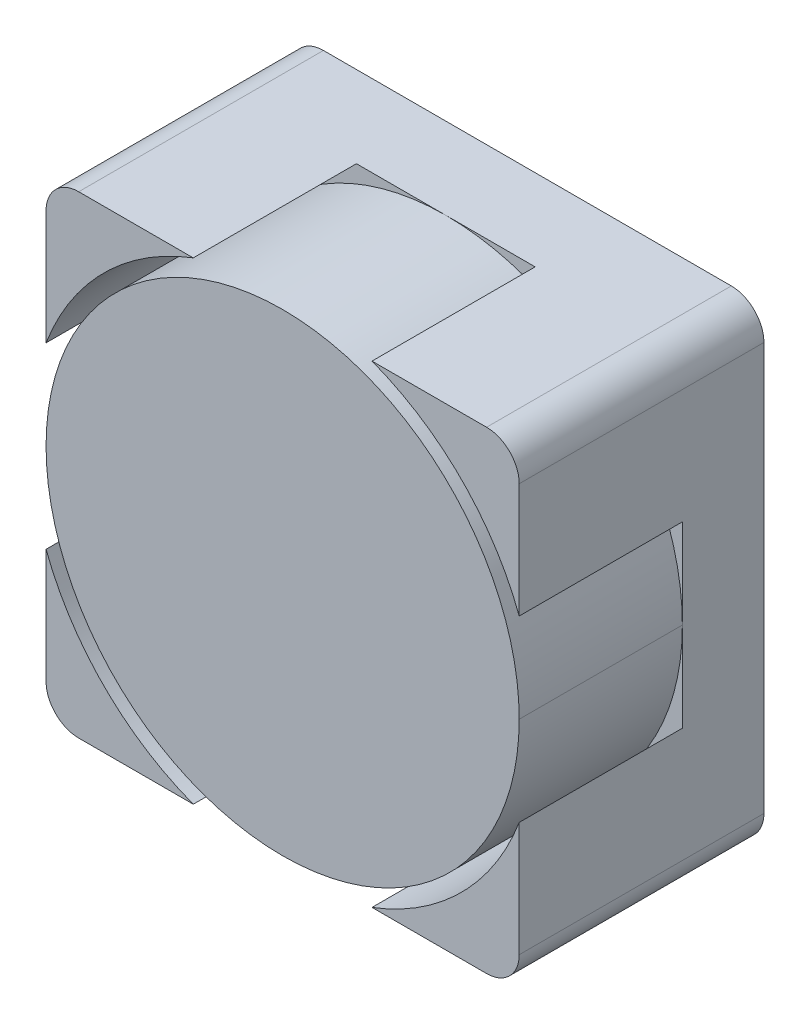
ISO-10303-21;
HEADER;
FILE_DESCRIPTION(('STEP AP214'),'2;1');
FILE_NAME('part.step','',(''),(''),'','','');
FILE_SCHEMA(('AUTOMOTIVE_DESIGN { 1 0 10303 214 1 1 1 1 }'));
ENDSEC;
DATA;
#1=APPLICATION_CONTEXT('core data for automotive mechanical design processes');
#2=APPLICATION_PROTOCOL_DEFINITION('international standard','automotive_design',2000,#1);
#3=PRODUCT_CONTEXT('',#1,'mechanical');
#4=PRODUCT('Part','Part','',(#3));
#5=PRODUCT_RELATED_PRODUCT_CATEGORY('part','',(#4));
#6=PRODUCT_DEFINITION_FORMATION('','',#4);
#7=PRODUCT_DEFINITION_CONTEXT('part definition',#1,'design');
#8=PRODUCT_DEFINITION('design','',#6,#7);
#9=PRODUCT_DEFINITION_SHAPE('','',#8);
#10=(LENGTH_UNIT() NAMED_UNIT(*) SI_UNIT(.MILLI.,.METRE.));
#11=(NAMED_UNIT(*) PLANE_ANGLE_UNIT() SI_UNIT($,.RADIAN.));
#12=(NAMED_UNIT(*) SI_UNIT($,.STERADIAN.) SOLID_ANGLE_UNIT());
#13=UNCERTAINTY_MEASURE_WITH_UNIT(LENGTH_MEASURE(1.E-05),#10,'distance_accuracy_value','');
#14=(GEOMETRIC_REPRESENTATION_CONTEXT(3) GLOBAL_UNCERTAINTY_ASSIGNED_CONTEXT((#13)) GLOBAL_UNIT_ASSIGNED_CONTEXT((#10,
#11,#12)) REPRESENTATION_CONTEXT('',''));
#15=CARTESIAN_POINT('',(0.,0.,0.));
#16=DIRECTION('',(0.,0.,1.));
#17=DIRECTION('',(1.,0.,0.));
#18=AXIS2_PLACEMENT_3D('',#15,#16,#17);
#19=CARTESIAN_POINT('',(2.5,2.5,3.));
#20=DIRECTION('',(0.,0.,-1.));
#21=DIRECTION('',(-1.,0.,0.));
#22=AXIS2_PLACEMENT_3D('',#19,#20,#21);
#23=CYLINDRICAL_SURFACE('',#22,0.4);
#24=CARTESIAN_POINT('',(2.5,2.5,0.));
#25=DIRECTION('',(0.,0.,1.));
#26=DIRECTION('',(-1.,0.,0.));
#27=AXIS2_PLACEMENT_3D('',#24,#25,#26);
#28=CIRCLE('',#27,0.4);
#29=CARTESIAN_POINT('',(2.9,2.5,0.));
#30=VERTEX_POINT('',#29);
#31=CARTESIAN_POINT('',(2.5,2.9,0.));
#32=VERTEX_POINT('',#31);
#33=EDGE_CURVE('E26',#30,#32,#28,.T.);
#34=ORIENTED_EDGE('',*,*,#33,.T.);
#35=DIRECTION('',(0.,0.,1.));
#36=VECTOR('',#35,1.);
#37=CARTESIAN_POINT('',(2.5,2.9,3.));
#38=LINE('',#37,#36);
#39=CARTESIAN_POINT('',(2.5,2.9,3.));
#40=VERTEX_POINT('',#39);
#41=EDGE_CURVE('E385',#32,#40,#38,.T.);
#42=ORIENTED_EDGE('',*,*,#41,.T.);
#43=CARTESIAN_POINT('',(2.5,2.5,3.));
#44=DIRECTION('',(0.,0.,1.));
#45=DIRECTION('',(-1.,0.,0.));
#46=AXIS2_PLACEMENT_3D('',#43,#44,#45);
#47=CIRCLE('',#46,0.4);
#48=CARTESIAN_POINT('',(2.9,2.5,3.));
#49=VERTEX_POINT('',#48);
#50=EDGE_CURVE('E403',#49,#40,#47,.T.);
#51=ORIENTED_EDGE('',*,*,#50,.F.);
#52=DIRECTION('',(0.,0.,-1.));
#53=VECTOR('',#52,1.);
#54=CARTESIAN_POINT('',(2.9,2.5,3.));
#55=LINE('',#54,#53);
#56=EDGE_CURVE('E411',#49,#30,#55,.T.);
#57=ORIENTED_EDGE('',*,*,#56,.T.);
#58=EDGE_LOOP('',(#34,#42,#51,#57));
#59=FACE_BOUND('',#58,.T.);
#60=ADVANCED_FACE('F17',(#59),#23,.T.);
#61=CARTESIAN_POINT('',(-2.5,2.5,3.));
#62=DIRECTION('',(0.,0.,-1.));
#63=DIRECTION('',(-1.,0.,0.));
#64=AXIS2_PLACEMENT_3D('',#61,#62,#63);
#65=CYLINDRICAL_SURFACE('',#64,0.4);
#66=CARTESIAN_POINT('',(-2.5,2.5,0.));
#67=DIRECTION('',(0.,0.,1.));
#68=DIRECTION('',(-1.,0.,0.));
#69=AXIS2_PLACEMENT_3D('',#66,#67,#68);
#70=CIRCLE('',#69,0.4);
#71=CARTESIAN_POINT('',(-2.5,2.9,0.));
#72=VERTEX_POINT('',#71);
#73=CARTESIAN_POINT('',(-2.9,2.5,0.));
#74=VERTEX_POINT('',#73);
#75=EDGE_CURVE('E377',#72,#74,#70,.T.);
#76=ORIENTED_EDGE('',*,*,#75,.T.);
#77=DIRECTION('',(0.,0.,1.));
#78=VECTOR('',#77,1.);
#79=CARTESIAN_POINT('',(-2.9,2.5,3.));
#80=LINE('',#79,#78);
#81=CARTESIAN_POINT('',(-2.9,2.5,3.));
#82=VERTEX_POINT('',#81);
#83=EDGE_CURVE('E267',#74,#82,#80,.T.);
#84=ORIENTED_EDGE('',*,*,#83,.T.);
#85=CARTESIAN_POINT('',(-2.5,2.5,3.));
#86=DIRECTION('',(0.,0.,1.));
#87=DIRECTION('',(-1.,0.,0.));
#88=AXIS2_PLACEMENT_3D('',#85,#86,#87);
#89=CIRCLE('',#88,0.4);
#90=CARTESIAN_POINT('',(-2.5,2.9,3.));
#91=VERTEX_POINT('',#90);
#92=EDGE_CURVE('E400',#91,#82,#89,.T.);
#93=ORIENTED_EDGE('',*,*,#92,.F.);
#94=DIRECTION('',(0.,0.,-1.));
#95=VECTOR('',#94,1.);
#96=CARTESIAN_POINT('',(-2.5,2.9,3.));
#97=LINE('',#96,#95);
#98=EDGE_CURVE('E392',#91,#72,#97,.T.);
#99=ORIENTED_EDGE('',*,*,#98,.T.);
#100=EDGE_LOOP('',(#76,#84,#93,#99));
#101=FACE_BOUND('',#100,.T.);
#102=ADVANCED_FACE('F769',(#101),#65,.T.);
#103=CARTESIAN_POINT('',(2.5,-2.5,3.));
#104=DIRECTION('',(0.,0.,-1.));
#105=DIRECTION('',(-1.,0.,0.));
#106=AXIS2_PLACEMENT_3D('',#103,#104,#105);
#107=CYLINDRICAL_SURFACE('',#106,0.4);
#108=CARTESIAN_POINT('',(2.5,-2.5,0.));
#109=DIRECTION('',(0.,0.,1.));
#110=DIRECTION('',(-1.,0.,0.));
#111=AXIS2_PLACEMENT_3D('',#108,#109,#110);
#112=CIRCLE('',#111,0.4);
#113=CARTESIAN_POINT('',(2.5,-2.9,0.));
#114=VERTEX_POINT('',#113);
#115=CARTESIAN_POINT('',(2.9,-2.5,0.));
#116=VERTEX_POINT('',#115);
#117=EDGE_CURVE('E11',#114,#116,#112,.T.);
#118=ORIENTED_EDGE('',*,*,#117,.T.);
#119=DIRECTION('',(0.,0.,1.));
#120=VECTOR('',#119,1.);
#121=CARTESIAN_POINT('',(2.9,-2.5,3.));
#122=LINE('',#121,#120);
#123=CARTESIAN_POINT('',(2.9,-2.5,3.));
#124=VERTEX_POINT('',#123);
#125=EDGE_CURVE('E325',#116,#124,#122,.T.);
#126=ORIENTED_EDGE('',*,*,#125,.T.);
#127=CARTESIAN_POINT('',(2.5,-2.5,3.));
#128=DIRECTION('',(0.,0.,1.));
#129=DIRECTION('',(-1.,0.,0.));
#130=AXIS2_PLACEMENT_3D('',#127,#128,#129);
#131=CIRCLE('',#130,0.4);
#132=CARTESIAN_POINT('',(2.5,-2.9,3.));
#133=VERTEX_POINT('',#132);
#134=EDGE_CURVE('E378',#133,#124,#131,.T.);
#135=ORIENTED_EDGE('',*,*,#134,.F.);
#136=DIRECTION('',(0.,0.,-1.));
#137=VECTOR('',#136,1.);
#138=CARTESIAN_POINT('',(2.5,-2.9,3.));
#139=LINE('',#138,#137);
#140=EDGE_CURVE('E356',#133,#114,#139,.T.);
#141=ORIENTED_EDGE('',*,*,#140,.T.);
#142=EDGE_LOOP('',(#118,#126,#135,#141));
#143=FACE_BOUND('',#142,.T.);
#144=ADVANCED_FACE('F19',(#143),#107,.T.);
#145=CARTESIAN_POINT('',(0.,0.,0.));
#146=DIRECTION('',(0.,0.,1.));
#147=DIRECTION('',(1.,0.,0.));
#148=AXIS2_PLACEMENT_3D('',#145,#146,#147);
#149=PLANE('',#148);
#150=CARTESIAN_POINT('',(-2.5,-2.5,0.));
#151=DIRECTION('',(0.,0.,1.));
#152=DIRECTION('',(-1.,0.,0.));
#153=AXIS2_PLACEMENT_3D('',#150,#151,#152);
#154=CIRCLE('',#153,0.4);
#155=CARTESIAN_POINT('',(-2.9,-2.5,0.));
#156=VERTEX_POINT('',#155);
#157=CARTESIAN_POINT('',(-2.5,-2.9,0.));
#158=VERTEX_POINT('',#157);
#159=EDGE_CURVE('E374',#156,#158,#154,.T.);
#160=ORIENTED_EDGE('',*,*,#159,.F.);
#161=DIRECTION('',(0.,1.,0.));
#162=VECTOR('',#161,1.);
#163=CARTESIAN_POINT('',(-2.9,-2.9,0.));
#164=LINE('',#163,#162);
#165=EDGE_CURVE('E271',#156,#74,#164,.T.);
#166=ORIENTED_EDGE('',*,*,#165,.T.);
#167=ORIENTED_EDGE('',*,*,#75,.F.);
#168=DIRECTION('',(1.,0.,0.));
#169=VECTOR('',#168,1.);
#170=CARTESIAN_POINT('',(2.9,2.9,0.));
#171=LINE('',#170,#169);
#172=EDGE_CURVE('E389',#72,#32,#171,.T.);
#173=ORIENTED_EDGE('',*,*,#172,.T.);
#174=ORIENTED_EDGE('',*,*,#33,.F.);
#175=DIRECTION('',(0.,-1.,0.));
#176=VECTOR('',#175,1.);
#177=CARTESIAN_POINT('',(2.9,-2.9,0.));
#178=LINE('',#177,#176);
#179=EDGE_CURVE('E328',#30,#116,#178,.T.);
#180=ORIENTED_EDGE('',*,*,#179,.T.);
#181=ORIENTED_EDGE('',*,*,#117,.F.);
#182=DIRECTION('',(-1.,0.,0.));
#183=VECTOR('',#182,1.);
#184=CARTESIAN_POINT('',(2.9,-2.9,0.));
#185=LINE('',#184,#183);
#186=EDGE_CURVE('E359',#114,#158,#185,.T.);
#187=ORIENTED_EDGE('',*,*,#186,.T.);
#188=EDGE_LOOP('',(#160,#166,#167,#173,#174,#180,#181,#187));
#189=FACE_BOUND('',#188,.T.);
#190=ADVANCED_FACE('F426',(#189),#149,.F.);
#191=CARTESIAN_POINT('',(-2.5,-2.5,3.));
#192=DIRECTION('',(0.,0.,-1.));
#193=DIRECTION('',(-1.,0.,0.));
#194=AXIS2_PLACEMENT_3D('',#191,#192,#193);
#195=CYLINDRICAL_SURFACE('',#194,0.4);
#196=ORIENTED_EDGE('',*,*,#159,.T.);
#197=DIRECTION('',(0.,0.,1.));
#198=VECTOR('',#197,1.);
#199=CARTESIAN_POINT('',(-2.5,-2.9,3.));
#200=LINE('',#199,#198);
#201=CARTESIAN_POINT('',(-2.5,-2.9,3.));
#202=VERTEX_POINT('',#201);
#203=EDGE_CURVE('E316',#158,#202,#200,.T.);
#204=ORIENTED_EDGE('',*,*,#203,.T.);
#205=CARTESIAN_POINT('',(-2.5,-2.5,3.));
#206=DIRECTION('',(0.,0.,-1.));
#207=DIRECTION('',(-1.,0.,0.));
#208=AXIS2_PLACEMENT_3D('',#205,#206,#207);
#209=CIRCLE('',#208,0.4);
#210=CARTESIAN_POINT('',(-2.9,-2.5,3.));
#211=VERTEX_POINT('',#210);
#212=EDGE_CURVE('E346',#202,#211,#209,.T.);
#213=ORIENTED_EDGE('',*,*,#212,.T.);
#214=DIRECTION('',(0.,0.,-1.));
#215=VECTOR('',#214,1.);
#216=CARTESIAN_POINT('',(-2.9,-2.5,3.));
#217=LINE('',#216,#215);
#218=EDGE_CURVE('E373',#211,#156,#217,.T.);
#219=ORIENTED_EDGE('',*,*,#218,.T.);
#220=EDGE_LOOP('',(#196,#204,#213,#219));
#221=FACE_BOUND('',#220,.T.);
#222=ADVANCED_FACE('F861',(#221),#195,.T.);
#223=CARTESIAN_POINT('',(0.,0.,3.));
#224=DIRECTION('',(0.,0.,1.));
#225=DIRECTION('',(1.,0.,0.));
#226=AXIS2_PLACEMENT_3D('',#223,#224,#225);
#227=PLANE('',#226);
#228=ORIENTED_EDGE('',*,*,#134,.T.);
#229=DIRECTION('',(0.,1.,0.));
#230=VECTOR('',#229,1.);
#231=CARTESIAN_POINT('',(2.9,-2.9,3.));
#232=LINE('',#231,#230);
#233=CARTESIAN_POINT('',(2.9,-1.09544511501033,3.));
#234=VERTEX_POINT('',#233);
#235=EDGE_CURVE('E329',#124,#234,#232,.T.);
#236=ORIENTED_EDGE('',*,*,#235,.T.);
#237=CARTESIAN_POINT('',(0.,0.,3.));
#238=DIRECTION('',(0.,0.,-1.));
#239=DIRECTION('',(1.,0.,0.));
#240=AXIS2_PLACEMENT_3D('',#237,#238,#239);
#241=CIRCLE('',#240,3.1);
#242=CARTESIAN_POINT('',(1.09544511501033,-2.9,3.));
#243=VERTEX_POINT('',#242);
#244=EDGE_CURVE('E342',#234,#243,#241,.T.);
#245=ORIENTED_EDGE('',*,*,#244,.T.);
#246=DIRECTION('',(1.,0.,0.));
#247=VECTOR('',#246,1.);
#248=CARTESIAN_POINT('',(2.9,-2.9,3.));
#249=LINE('',#248,#247);
#250=EDGE_CURVE('E352',#243,#133,#249,.T.);
#251=ORIENTED_EDGE('',*,*,#250,.T.);
#252=EDGE_LOOP('',(#228,#236,#245,#251));
#253=FACE_BOUND('',#252,.T.);
#254=ADVANCED_FACE('F702',(#253),#227,.T.);
#255=CARTESIAN_POINT('',(2.9,-2.9,3.));
#256=DIRECTION('',(-1.,0.,0.));
#257=DIRECTION('',(0.,1.,0.));
#258=AXIS2_PLACEMENT_3D('',#255,#256,#257);
#259=PLANE('',#258);
#260=DIRECTION('',(0.,0.,1.));
#261=VECTOR('',#260,1.);
#262=CARTESIAN_POINT('',(2.9,-1.09544511501033,-8.76812408671319));
#263=LINE('',#262,#261);
#264=CARTESIAN_POINT('',(2.9,-1.09544511501033,1.));
#265=VERTEX_POINT('',#264);
#266=EDGE_CURVE('E336',#265,#234,#263,.T.);
#267=ORIENTED_EDGE('',*,*,#266,.T.);
#268=ORIENTED_EDGE('',*,*,#235,.F.);
#269=ORIENTED_EDGE('',*,*,#125,.F.);
#270=ORIENTED_EDGE('',*,*,#179,.F.);
#271=ORIENTED_EDGE('',*,*,#56,.F.);
#272=DIRECTION('',(0.,1.,0.));
#273=VECTOR('',#272,1.);
#274=CARTESIAN_POINT('',(2.9,0.,3.));
#275=LINE('',#274,#273);
#276=CARTESIAN_POINT('',(2.9,1.09544511501033,3.));
#277=VERTEX_POINT('',#276);
#278=EDGE_CURVE('E362',#277,#49,#275,.T.);
#279=ORIENTED_EDGE('',*,*,#278,.F.);
#280=DIRECTION('',(0.,0.,-1.));
#281=VECTOR('',#280,1.);
#282=CARTESIAN_POINT('',(2.9,1.09544511501033,-8.76812408671319));
#283=LINE('',#282,#281);
#284=CARTESIAN_POINT('',(2.9,1.09544511501033,1.));
#285=VERTEX_POINT('',#284);
#286=EDGE_CURVE('E214',#277,#285,#283,.T.);
#287=ORIENTED_EDGE('',*,*,#286,.T.);
#288=DIRECTION('',(0.,1.,0.));
#289=VECTOR('',#288,1.);
#290=CARTESIAN_POINT('',(2.9,-2.9,1.));
#291=LINE('',#290,#289);
#292=CARTESIAN_POINT('',(2.9,0.,1.));
#293=VERTEX_POINT('',#292);
#294=EDGE_CURVE('E211',#293,#285,#291,.T.);
#295=ORIENTED_EDGE('',*,*,#294,.F.);
#296=DIRECTION('',(0.,1.,0.));
#297=VECTOR('',#296,1.);
#298=CARTESIAN_POINT('',(2.9,-2.9,1.));
#299=LINE('',#298,#297);
#300=EDGE_CURVE('E195',#265,#293,#299,.T.);
#301=ORIENTED_EDGE('',*,*,#300,.F.);
#302=EDGE_LOOP('',(#267,#268,#269,#270,#271,#279,#287,#295,#301));
#303=FACE_BOUND('',#302,.T.);
#304=ADVANCED_FACE('F212',(#303),#259,.F.);
#305=CARTESIAN_POINT('',(0.,0.,3.));
#306=DIRECTION('',(0.,0.,1.));
#307=DIRECTION('',(1.,0.,0.));
#308=AXIS2_PLACEMENT_3D('',#305,#306,#307);
#309=PLANE('',#308);
#310=ORIENTED_EDGE('',*,*,#50,.T.);
#311=DIRECTION('',(-1.,0.,0.));
#312=VECTOR('',#311,1.);
#313=CARTESIAN_POINT('',(2.9,2.9,3.));
#314=LINE('',#313,#312);
#315=CARTESIAN_POINT('',(1.09544511501033,2.9,3.));
#316=VERTEX_POINT('',#315);
#317=EDGE_CURVE('E382',#40,#316,#314,.T.);
#318=ORIENTED_EDGE('',*,*,#317,.T.);
#319=CARTESIAN_POINT('',(0.,0.,3.));
#320=DIRECTION('',(0.,0.,-1.));
#321=DIRECTION('',(1.,0.,0.));
#322=AXIS2_PLACEMENT_3D('',#319,#320,#321);
#323=CIRCLE('',#322,3.1);
#324=EDGE_CURVE('E332',#316,#277,#323,.T.);
#325=ORIENTED_EDGE('',*,*,#324,.T.);
#326=ORIENTED_EDGE('',*,*,#278,.T.);
#327=EDGE_LOOP('',(#310,#318,#325,#326));
#328=FACE_BOUND('',#327,.T.);
#329=ADVANCED_FACE('F432',(#328),#309,.T.);
#330=CARTESIAN_POINT('',(0.,0.,3.));
#331=DIRECTION('',(0.,0.,1.));
#332=DIRECTION('',(1.,0.,0.));
#333=AXIS2_PLACEMENT_3D('',#330,#331,#332);
#334=PLANE('',#333);
#335=ORIENTED_EDGE('',*,*,#92,.T.);
#336=DIRECTION('',(0.,-1.,0.));
#337=VECTOR('',#336,1.);
#338=CARTESIAN_POINT('',(-2.9,-2.9,3.));
#339=LINE('',#338,#337);
#340=CARTESIAN_POINT('',(-2.9,1.09544511501033,3.));
#341=VERTEX_POINT('',#340);
#342=EDGE_CURVE('E272',#82,#341,#339,.T.);
#343=ORIENTED_EDGE('',*,*,#342,.T.);
#344=CARTESIAN_POINT('',(0.,0.,3.));
#345=DIRECTION('',(0.,0.,-1.));
#346=DIRECTION('',(1.,0.,0.));
#347=AXIS2_PLACEMENT_3D('',#344,#345,#346);
#348=CIRCLE('',#347,3.1);
#349=CARTESIAN_POINT('',(-1.09544511501033,2.9,3.));
#350=VERTEX_POINT('',#349);
#351=EDGE_CURVE('E307',#341,#350,#348,.T.);
#352=ORIENTED_EDGE('',*,*,#351,.T.);
#353=DIRECTION('',(-1.,0.,0.));
#354=VECTOR('',#353,1.);
#355=CARTESIAN_POINT('',(2.9,2.9,3.));
#356=LINE('',#355,#354);
#357=EDGE_CURVE('E396',#350,#91,#356,.T.);
#358=ORIENTED_EDGE('',*,*,#357,.T.);
#359=EDGE_LOOP('',(#335,#343,#352,#358));
#360=FACE_BOUND('',#359,.T.);
#361=ADVANCED_FACE('F823',(#360),#334,.T.);
#362=CARTESIAN_POINT('',(2.9,2.9,3.));
#363=DIRECTION('',(0.,-1.,0.));
#364=DIRECTION('',(0.,0.,-1.));
#365=AXIS2_PLACEMENT_3D('',#362,#363,#364);
#366=PLANE('',#365);
#367=DIRECTION('',(0.,0.,1.));
#368=VECTOR('',#367,1.);
#369=CARTESIAN_POINT('',(1.09544511501033,2.9,-8.76812408671319));
#370=LINE('',#369,#368);
#371=CARTESIAN_POINT('',(1.09544511501033,2.9,1.));
#372=VERTEX_POINT('',#371);
#373=EDGE_CURVE('E321',#372,#316,#370,.T.);
#374=ORIENTED_EDGE('',*,*,#373,.T.);
#375=ORIENTED_EDGE('',*,*,#317,.F.);
#376=ORIENTED_EDGE('',*,*,#41,.F.);
#377=ORIENTED_EDGE('',*,*,#172,.F.);
#378=ORIENTED_EDGE('',*,*,#98,.F.);
#379=ORIENTED_EDGE('',*,*,#357,.F.);
#380=DIRECTION('',(0.,0.,-1.));
#381=VECTOR('',#380,1.);
#382=CARTESIAN_POINT('',(-1.09544511501033,2.9,-8.76812408671319));
#383=LINE('',#382,#381);
#384=CARTESIAN_POINT('',(-1.09544511501033,2.9,1.));
#385=VERTEX_POINT('',#384);
#386=EDGE_CURVE('E304',#350,#385,#383,.T.);
#387=ORIENTED_EDGE('',*,*,#386,.T.);
#388=DIRECTION('',(-1.,0.,0.));
#389=VECTOR('',#388,1.);
#390=CARTESIAN_POINT('',(2.9,2.9,1.));
#391=LINE('',#390,#389);
#392=CARTESIAN_POINT('',(0.,2.9,1.));
#393=VERTEX_POINT('',#392);
#394=EDGE_CURVE('E277',#393,#385,#391,.T.);
#395=ORIENTED_EDGE('',*,*,#394,.F.);
#396=DIRECTION('',(-1.,0.,0.));
#397=VECTOR('',#396,1.);
#398=CARTESIAN_POINT('',(2.9,2.9,1.));
#399=LINE('',#398,#397);
#400=EDGE_CURVE('E220',#372,#393,#399,.T.);
#401=ORIENTED_EDGE('',*,*,#400,.F.);
#402=EDGE_LOOP('',(#374,#375,#376,#377,#378,#379,#387,#395,#401));
#403=FACE_BOUND('',#402,.T.);
#404=ADVANCED_FACE('F429',(#403),#366,.F.);
#405=CARTESIAN_POINT('',(-2.9,-2.9,3.));
#406=DIRECTION('',(1.,0.,0.));
#407=DIRECTION('',(0.,1.,0.));
#408=AXIS2_PLACEMENT_3D('',#405,#406,#407);
#409=PLANE('',#408);
#410=DIRECTION('',(0.,0.,1.));
#411=VECTOR('',#410,1.);
#412=CARTESIAN_POINT('',(-2.9,1.09544511501033,-8.76812408671319));
#413=LINE('',#412,#411);
#414=CARTESIAN_POINT('',(-2.9,1.09544511501033,1.));
#415=VERTEX_POINT('',#414);
#416=EDGE_CURVE('E311',#415,#341,#413,.T.);
#417=ORIENTED_EDGE('',*,*,#416,.T.);
#418=ORIENTED_EDGE('',*,*,#342,.F.);
#419=ORIENTED_EDGE('',*,*,#83,.F.);
#420=ORIENTED_EDGE('',*,*,#165,.F.);
#421=ORIENTED_EDGE('',*,*,#218,.F.);
#422=DIRECTION('',(0.,-1.,0.));
#423=VECTOR('',#422,1.);
#424=CARTESIAN_POINT('',(-2.9,0.,3.));
#425=LINE('',#424,#423);
#426=CARTESIAN_POINT('',(-2.9,-1.09544511501033,3.));
#427=VERTEX_POINT('',#426);
#428=EDGE_CURVE('E312',#427,#211,#425,.T.);
#429=ORIENTED_EDGE('',*,*,#428,.F.);
#430=DIRECTION('',(0.,0.,-1.));
#431=VECTOR('',#430,1.);
#432=CARTESIAN_POINT('',(-2.9,-1.09544511501033,-8.76812408671319));
#433=LINE('',#432,#431);
#434=CARTESIAN_POINT('',(-2.9,-1.09544511501033,1.));
#435=VERTEX_POINT('',#434);
#436=EDGE_CURVE('E297',#427,#435,#433,.T.);
#437=ORIENTED_EDGE('',*,*,#436,.T.);
#438=DIRECTION('',(0.,-1.,0.));
#439=VECTOR('',#438,1.);
#440=CARTESIAN_POINT('',(-2.9,-2.9,1.));
#441=LINE('',#440,#439);
#442=CARTESIAN_POINT('',(-2.9,0.,1.));
#443=VERTEX_POINT('',#442);
#444=EDGE_CURVE('E276',#443,#435,#441,.T.);
#445=ORIENTED_EDGE('',*,*,#444,.F.);
#446=DIRECTION('',(0.,-1.,0.));
#447=VECTOR('',#446,1.);
#448=CARTESIAN_POINT('',(-2.9,-2.9,1.));
#449=LINE('',#448,#447);
#450=EDGE_CURVE('E265',#415,#443,#449,.T.);
#451=ORIENTED_EDGE('',*,*,#450,.F.);
#452=EDGE_LOOP('',(#417,#418,#419,#420,#421,#429,#437,#445,#451));
#453=FACE_BOUND('',#452,.T.);
#454=ADVANCED_FACE('F793',(#453),#409,.F.);
#455=CARTESIAN_POINT('',(2.9,-2.9,3.));
#456=DIRECTION('',(0.,1.,0.));
#457=DIRECTION('',(1.,0.,0.));
#458=AXIS2_PLACEMENT_3D('',#455,#456,#457);
#459=PLANE('',#458);
#460=DIRECTION('',(0.,0.,1.));
#461=VECTOR('',#460,1.);
#462=CARTESIAN_POINT('',(-1.09544511501033,-2.9,-8.76812408671319));
#463=LINE('',#462,#461);
#464=CARTESIAN_POINT('',(-1.09544511501033,-2.9,1.));
#465=VERTEX_POINT('',#464);
#466=CARTESIAN_POINT('',(-1.09544511501033,-2.9,3.));
#467=VERTEX_POINT('',#466);
#468=EDGE_CURVE('E293',#465,#467,#463,.T.);
#469=ORIENTED_EDGE('',*,*,#468,.T.);
#470=DIRECTION('',(1.,0.,0.));
#471=VECTOR('',#470,1.);
#472=CARTESIAN_POINT('',(0.,-2.9,3.));
#473=LINE('',#472,#471);
#474=EDGE_CURVE('E317',#202,#467,#473,.T.);
#475=ORIENTED_EDGE('',*,*,#474,.F.);
#476=ORIENTED_EDGE('',*,*,#203,.F.);
#477=ORIENTED_EDGE('',*,*,#186,.F.);
#478=ORIENTED_EDGE('',*,*,#140,.F.);
#479=ORIENTED_EDGE('',*,*,#250,.F.);
#480=DIRECTION('',(0.,0.,-1.));
#481=VECTOR('',#480,1.);
#482=CARTESIAN_POINT('',(1.09544511501033,-2.9,-8.76812408671319));
#483=LINE('',#482,#481);
#484=CARTESIAN_POINT('',(1.09544511501033,-2.9,1.));
#485=VERTEX_POINT('',#484);
#486=EDGE_CURVE('E339',#243,#485,#483,.T.);
#487=ORIENTED_EDGE('',*,*,#486,.T.);
#488=DIRECTION('',(1.,0.,0.));
#489=VECTOR('',#488,1.);
#490=CARTESIAN_POINT('',(2.9,-2.9,1.));
#491=LINE('',#490,#489);
#492=CARTESIAN_POINT('',(0.,-2.9,1.));
#493=VERTEX_POINT('',#492);
#494=EDGE_CURVE('E207',#493,#485,#491,.T.);
#495=ORIENTED_EDGE('',*,*,#494,.F.);
#496=DIRECTION('',(1.,0.,0.));
#497=VECTOR('',#496,1.);
#498=CARTESIAN_POINT('',(2.9,-2.9,1.));
#499=LINE('',#498,#497);
#500=EDGE_CURVE('E260',#465,#493,#499,.T.);
#501=ORIENTED_EDGE('',*,*,#500,.F.);
#502=EDGE_LOOP('',(#469,#475,#476,#477,#478,#479,#487,#495,#501));
#503=FACE_BOUND('',#502,.T.);
#504=ADVANCED_FACE('F671',(#503),#459,.F.);
#505=CARTESIAN_POINT('',(0.,0.,3.));
#506=DIRECTION('',(0.,0.,1.));
#507=DIRECTION('',(1.,0.,0.));
#508=AXIS2_PLACEMENT_3D('',#505,#506,#507);
#509=PLANE('',#508);
#510=ORIENTED_EDGE('',*,*,#212,.F.);
#511=ORIENTED_EDGE('',*,*,#474,.T.);
#512=CARTESIAN_POINT('',(0.,0.,3.));
#513=DIRECTION('',(0.,0.,-1.));
#514=DIRECTION('',(1.,0.,0.));
#515=AXIS2_PLACEMENT_3D('',#512,#513,#514);
#516=CIRCLE('',#515,3.1);
#517=EDGE_CURVE('E300',#467,#427,#516,.T.);
#518=ORIENTED_EDGE('',*,*,#517,.T.);
#519=ORIENTED_EDGE('',*,*,#428,.T.);
#520=EDGE_LOOP('',(#510,#511,#518,#519));
#521=FACE_BOUND('',#520,.T.);
#522=ADVANCED_FACE('F666',(#521),#509,.T.);
#523=CARTESIAN_POINT('',(0.,0.,-8.76812408671319));
#524=DIRECTION('',(0.,0.,1.));
#525=DIRECTION('',(1.,0.,0.));
#526=AXIS2_PLACEMENT_3D('',#523,#524,#525);
#527=CYLINDRICAL_SURFACE('',#526,3.1);
#528=ORIENTED_EDGE('',*,*,#266,.F.);
#529=CARTESIAN_POINT('',(0.,0.,1.));
#530=DIRECTION('',(0.,0.,1.));
#531=DIRECTION('',(1.,0.,0.));
#532=AXIS2_PLACEMENT_3D('',#529,#530,#531);
#533=CIRCLE('',#532,3.1);
#534=EDGE_CURVE('E203',#485,#265,#533,.T.);
#535=ORIENTED_EDGE('',*,*,#534,.F.);
#536=ORIENTED_EDGE('',*,*,#486,.F.);
#537=ORIENTED_EDGE('',*,*,#244,.F.);
#538=EDGE_LOOP('',(#528,#535,#536,#537));
#539=FACE_BOUND('',#538,.T.);
#540=ADVANCED_FACE('F670',(#539),#527,.F.);
#541=CARTESIAN_POINT('',(0.,0.,-8.76812408671319));
#542=DIRECTION('',(0.,0.,1.));
#543=DIRECTION('',(1.,0.,0.));
#544=AXIS2_PLACEMENT_3D('',#541,#542,#543);
#545=CYLINDRICAL_SURFACE('',#544,3.1);
#546=ORIENTED_EDGE('',*,*,#373,.F.);
#547=CARTESIAN_POINT('',(0.,0.,1.));
#548=DIRECTION('',(0.,0.,1.));
#549=DIRECTION('',(1.,0.,0.));
#550=AXIS2_PLACEMENT_3D('',#547,#548,#549);
#551=CIRCLE('',#550,3.1);
#552=EDGE_CURVE('E208',#285,#372,#551,.T.);
#553=ORIENTED_EDGE('',*,*,#552,.F.);
#554=ORIENTED_EDGE('',*,*,#286,.F.);
#555=ORIENTED_EDGE('',*,*,#324,.F.);
#556=EDGE_LOOP('',(#546,#553,#554,#555));
#557=FACE_BOUND('',#556,.T.);
#558=ADVANCED_FACE('F434',(#557),#545,.F.);
#559=CARTESIAN_POINT('',(0.,0.,-8.76812408671319));
#560=DIRECTION('',(0.,0.,1.));
#561=DIRECTION('',(1.,0.,0.));
#562=AXIS2_PLACEMENT_3D('',#559,#560,#561);
#563=CYLINDRICAL_SURFACE('',#562,3.1);
#564=ORIENTED_EDGE('',*,*,#386,.F.);
#565=ORIENTED_EDGE('',*,*,#351,.F.);
#566=ORIENTED_EDGE('',*,*,#416,.F.);
#567=CARTESIAN_POINT('',(0.,0.,1.));
#568=DIRECTION('',(0.,0.,1.));
#569=DIRECTION('',(1.,0.,0.));
#570=AXIS2_PLACEMENT_3D('',#567,#568,#569);
#571=CIRCLE('',#570,3.1);
#572=EDGE_CURVE('E281',#385,#415,#571,.T.);
#573=ORIENTED_EDGE('',*,*,#572,.F.);
#574=EDGE_LOOP('',(#564,#565,#566,#573));
#575=FACE_BOUND('',#574,.T.);
#576=ADVANCED_FACE('F751',(#575),#563,.F.);
#577=CARTESIAN_POINT('',(0.,0.,-8.76812408671319));
#578=DIRECTION('',(0.,0.,1.));
#579=DIRECTION('',(1.,0.,0.));
#580=AXIS2_PLACEMENT_3D('',#577,#578,#579);
#581=CYLINDRICAL_SURFACE('',#580,3.1);
#582=ORIENTED_EDGE('',*,*,#468,.F.);
#583=CARTESIAN_POINT('',(0.,0.,1.));
#584=DIRECTION('',(0.,0.,1.));
#585=DIRECTION('',(1.,0.,0.));
#586=AXIS2_PLACEMENT_3D('',#583,#584,#585);
#587=CIRCLE('',#586,3.1);
#588=EDGE_CURVE('E282',#435,#465,#587,.T.);
#589=ORIENTED_EDGE('',*,*,#588,.F.);
#590=ORIENTED_EDGE('',*,*,#436,.F.);
#591=ORIENTED_EDGE('',*,*,#517,.F.);
#592=EDGE_LOOP('',(#582,#589,#590,#591));
#593=FACE_BOUND('',#592,.T.);
#594=ADVANCED_FACE('F747',(#593),#581,.F.);
#595=CARTESIAN_POINT('',(0.,0.,3.));
#596=DIRECTION('',(0.,0.,1.));
#597=DIRECTION('',(1.,0.,0.));
#598=AXIS2_PLACEMENT_3D('',#595,#596,#597);
#599=PLANE('',#598);
#600=CARTESIAN_POINT('',(0.,0.,3.));
#601=DIRECTION('',(0.,0.,-1.));
#602=DIRECTION('',(1.,0.,0.));
#603=AXIS2_PLACEMENT_3D('',#600,#601,#602);
#604=CIRCLE('',#603,2.9);
#605=CARTESIAN_POINT('',(2.9,0.,3.));
#606=VERTEX_POINT('',#605);
#607=CARTESIAN_POINT('',(-2.9,0.,3.));
#608=VERTEX_POINT('',#607);
#609=EDGE_CURVE('E232',#606,#608,#604,.T.);
#610=ORIENTED_EDGE('',*,*,#609,.F.);
#611=CARTESIAN_POINT('',(0.,0.,3.));
#612=DIRECTION('',(0.,0.,-1.));
#613=DIRECTION('',(1.,0.,0.));
#614=AXIS2_PLACEMENT_3D('',#611,#612,#613);
#615=CIRCLE('',#614,2.9);
#616=EDGE_CURVE('E247',#608,#606,#615,.T.);
#617=ORIENTED_EDGE('',*,*,#616,.F.);
#618=EDGE_LOOP('',(#610,#617));
#619=FACE_BOUND('',#618,.T.);
#620=ADVANCED_FACE('F740',(#619),#599,.T.);
#621=CARTESIAN_POINT('',(0.,0.,1.));
#622=DIRECTION('',(0.,0.,1.));
#623=DIRECTION('',(1.,0.,0.));
#624=AXIS2_PLACEMENT_3D('',#621,#622,#623);
#625=PLANE('',#624);
#626=ORIENTED_EDGE('',*,*,#300,.T.);
#627=CARTESIAN_POINT('',(0.,0.,1.));
#628=DIRECTION('',(0.,0.,1.));
#629=DIRECTION('',(1.,0.,0.));
#630=AXIS2_PLACEMENT_3D('',#627,#628,#629);
#631=CIRCLE('',#630,2.9);
#632=EDGE_CURVE('E200',#493,#293,#631,.T.);
#633=ORIENTED_EDGE('',*,*,#632,.F.);
#634=ORIENTED_EDGE('',*,*,#494,.T.);
#635=ORIENTED_EDGE('',*,*,#534,.T.);
#636=EDGE_LOOP('',(#626,#633,#634,#635));
#637=FACE_BOUND('',#636,.T.);
#638=ADVANCED_FACE('F197',(#637),#625,.T.);
#639=CARTESIAN_POINT('',(0.,0.,1.));
#640=DIRECTION('',(0.,0.,1.));
#641=DIRECTION('',(1.,0.,0.));
#642=AXIS2_PLACEMENT_3D('',#639,#640,#641);
#643=PLANE('',#642);
#644=ORIENTED_EDGE('',*,*,#400,.T.);
#645=CARTESIAN_POINT('',(0.,0.,1.));
#646=DIRECTION('',(0.,0.,1.));
#647=DIRECTION('',(1.,0.,0.));
#648=AXIS2_PLACEMENT_3D('',#645,#646,#647);
#649=CIRCLE('',#648,2.9);
#650=EDGE_CURVE('E235',#293,#393,#649,.T.);
#651=ORIENTED_EDGE('',*,*,#650,.F.);
#652=ORIENTED_EDGE('',*,*,#294,.T.);
#653=ORIENTED_EDGE('',*,*,#552,.T.);
#654=EDGE_LOOP('',(#644,#651,#652,#653));
#655=FACE_BOUND('',#654,.T.);
#656=ADVANCED_FACE('F236',(#655),#643,.T.);
#657=CARTESIAN_POINT('',(0.,0.,1.));
#658=DIRECTION('',(0.,0.,1.));
#659=DIRECTION('',(1.,0.,0.));
#660=AXIS2_PLACEMENT_3D('',#657,#658,#659);
#661=PLANE('',#660);
#662=ORIENTED_EDGE('',*,*,#394,.T.);
#663=ORIENTED_EDGE('',*,*,#572,.T.);
#664=ORIENTED_EDGE('',*,*,#450,.T.);
#665=CARTESIAN_POINT('',(0.,0.,1.));
#666=DIRECTION('',(0.,0.,1.));
#667=DIRECTION('',(1.,0.,0.));
#668=AXIS2_PLACEMENT_3D('',#665,#666,#667);
#669=CIRCLE('',#668,2.9);
#670=EDGE_CURVE('E440',#393,#443,#669,.T.);
#671=ORIENTED_EDGE('',*,*,#670,.F.);
#672=EDGE_LOOP('',(#662,#663,#664,#671));
#673=FACE_BOUND('',#672,.T.);
#674=ADVANCED_FACE('F439',(#673),#661,.T.);
#675=CARTESIAN_POINT('',(0.,0.,1.));
#676=DIRECTION('',(0.,0.,1.));
#677=DIRECTION('',(1.,0.,0.));
#678=AXIS2_PLACEMENT_3D('',#675,#676,#677);
#679=PLANE('',#678);
#680=ORIENTED_EDGE('',*,*,#500,.T.);
#681=CARTESIAN_POINT('',(0.,0.,1.));
#682=DIRECTION('',(0.,0.,1.));
#683=DIRECTION('',(1.,0.,0.));
#684=AXIS2_PLACEMENT_3D('',#681,#682,#683);
#685=CIRCLE('',#684,2.9);
#686=EDGE_CURVE('E230',#443,#493,#685,.T.);
#687=ORIENTED_EDGE('',*,*,#686,.F.);
#688=ORIENTED_EDGE('',*,*,#444,.T.);
#689=ORIENTED_EDGE('',*,*,#588,.T.);
#690=EDGE_LOOP('',(#680,#687,#688,#689));
#691=FACE_BOUND('',#690,.T.);
#692=ADVANCED_FACE('F682',(#691),#679,.T.);
#693=CARTESIAN_POINT('',(0.,0.,-8.76812408671319));
#694=DIRECTION('',(0.,0.,1.));
#695=DIRECTION('',(1.,0.,0.));
#696=AXIS2_PLACEMENT_3D('',#693,#694,#695);
#697=CYLINDRICAL_SURFACE('',#696,2.9);
#698=DIRECTION('',(0.,0.,1.));
#699=VECTOR('',#698,1.);
#700=CARTESIAN_POINT('',(-2.9,0.,-8.76812408671319));
#701=LINE('',#700,#699);
#702=EDGE_CURVE('E254',#443,#608,#701,.T.);
#703=ORIENTED_EDGE('',*,*,#702,.F.);
#704=ORIENTED_EDGE('',*,*,#686,.T.);
#705=ORIENTED_EDGE('',*,*,#632,.T.);
#706=DIRECTION('',(0.,0.,1.));
#707=VECTOR('',#706,1.);
#708=CARTESIAN_POINT('',(2.9,0.,-8.76812408671319));
#709=LINE('',#708,#707);
#710=EDGE_CURVE('E227',#293,#606,#709,.T.);
#711=ORIENTED_EDGE('',*,*,#710,.T.);
#712=ORIENTED_EDGE('',*,*,#609,.T.);
#713=EDGE_LOOP('',(#703,#704,#705,#711,#712));
#714=FACE_BOUND('',#713,.T.);
#715=ADVANCED_FACE('F225',(#714),#697,.T.);
#716=CARTESIAN_POINT('',(0.,0.,-8.76812408671319));
#717=DIRECTION('',(0.,0.,1.));
#718=DIRECTION('',(1.,0.,0.));
#719=AXIS2_PLACEMENT_3D('',#716,#717,#718);
#720=CYLINDRICAL_SURFACE('',#719,2.9);
#721=ORIENTED_EDGE('',*,*,#670,.T.);
#722=ORIENTED_EDGE('',*,*,#702,.T.);
#723=ORIENTED_EDGE('',*,*,#616,.T.);
#724=ORIENTED_EDGE('',*,*,#710,.F.);
#725=ORIENTED_EDGE('',*,*,#650,.T.);
#726=EDGE_LOOP('',(#721,#722,#723,#724,#725));
#727=FACE_BOUND('',#726,.T.);
#728=ADVANCED_FACE('F244',(#727),#720,.T.);
#729=CLOSED_SHELL('',(#60,#102,#144,#190,#222,#254,#304,#329,#361,#404,#454,#504,#522,#540,#558,
#576,#594,#620,#638,#656,#674,#692,#715,#728));
#730=MANIFOLD_SOLID_BREP('B1',#729);
#731=ADVANCED_BREP_SHAPE_REPRESENTATION('',(#18,#730),#14);
#732=SHAPE_DEFINITION_REPRESENTATION(#9,#731);
ENDSEC;
END-ISO-10303-21;
